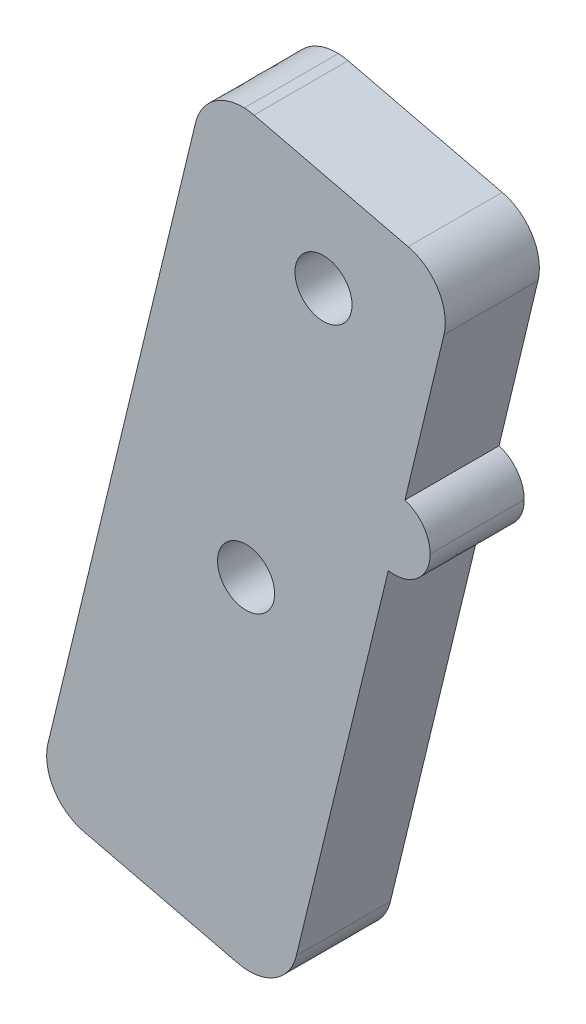
ISO-10303-21;
HEADER;
FILE_DESCRIPTION(('STEP AP214'),'2;1');
FILE_NAME('part.step','',(''),(''),'','','');
FILE_SCHEMA(('AUTOMOTIVE_DESIGN { 1 0 10303 214 1 1 1 1 }'));
ENDSEC;
DATA;
#1=APPLICATION_CONTEXT('core data for automotive mechanical design processes');
#2=APPLICATION_PROTOCOL_DEFINITION('international standard','automotive_design',2000,#1);
#3=PRODUCT_CONTEXT('',#1,'mechanical');
#4=PRODUCT('Part','Part','',(#3));
#5=PRODUCT_RELATED_PRODUCT_CATEGORY('part','',(#4));
#6=PRODUCT_DEFINITION_FORMATION('','',#4);
#7=PRODUCT_DEFINITION_CONTEXT('part definition',#1,'design');
#8=PRODUCT_DEFINITION('design','',#6,#7);
#9=PRODUCT_DEFINITION_SHAPE('','',#8);
#10=(LENGTH_UNIT() NAMED_UNIT(*) SI_UNIT(.MILLI.,.METRE.));
#11=(NAMED_UNIT(*) PLANE_ANGLE_UNIT() SI_UNIT($,.RADIAN.));
#12=(NAMED_UNIT(*) SI_UNIT($,.STERADIAN.) SOLID_ANGLE_UNIT());
#13=UNCERTAINTY_MEASURE_WITH_UNIT(LENGTH_MEASURE(1.E-05),#10,'distance_accuracy_value','');
#14=(GEOMETRIC_REPRESENTATION_CONTEXT(3) GLOBAL_UNCERTAINTY_ASSIGNED_CONTEXT((#13)) GLOBAL_UNIT_ASSIGNED_CONTEXT((#10,
#11,#12)) REPRESENTATION_CONTEXT('',''));
#15=CARTESIAN_POINT('',(0.,0.,0.));
#16=DIRECTION('',(0.,0.,1.));
#17=DIRECTION('',(1.,0.,0.));
#18=AXIS2_PLACEMENT_3D('',#15,#16,#17);
#19=CARTESIAN_POINT('',(-259.2686875,80.2486875,6.35));
#20=DIRECTION('',(0.,0.,-1.));
#21=DIRECTION('',(-1.,0.,0.));
#22=AXIS2_PLACEMENT_3D('',#19,#20,#21);
#23=PLANE('',#22);
#24=CARTESIAN_POINT('',(-258.9389,80.1862,6.35));
#25=CARTESIAN_POINT('',(-259.1594,80.2398,6.35));
#26=CARTESIAN_POINT('',(-259.3787,80.2689,6.35));
#27=CARTESIAN_POINT('',(-259.5963,80.2772,6.35));
#28=B_SPLINE_CURVE_WITH_KNOTS('',3,(#24,#25,#26,#27),.UNSPECIFIED.,.F.,.F.,(4,4),
(0.857142857142857,1.),.UNSPECIFIED.);
#29=CARTESIAN_POINT('',(-258.9389,80.1862,6.35));
#30=VERTEX_POINT('',#29);
#31=CARTESIAN_POINT('',(-259.5963,80.2772,6.35));
#32=VERTEX_POINT('',#31);
#33=EDGE_CURVE('E252',#30,#32,#28,.T.);
#34=ORIENTED_EDGE('',*,*,#33,.T.);
#35=CARTESIAN_POINT('',(-259.5963,80.2772,6.35));
#36=CARTESIAN_POINT('',(-261.1217,80.3295,6.35));
#37=CARTESIAN_POINT('',(-262.5167,79.3095,6.35));
#38=CARTESIAN_POINT('',(-262.8855,77.7663,6.35));
#39=B_SPLINE_CURVE_WITH_KNOTS('',3,(#35,#36,#37,#38),.UNSPECIFIED.,.F.,.F.,(4,4),(0.,
0.0714285714285714),.UNSPECIFIED.);
#40=CARTESIAN_POINT('',(-262.8855,77.7663,6.35));
#41=VERTEX_POINT('',#40);
#42=EDGE_CURVE('E109',#32,#41,#39,.T.);
#43=ORIENTED_EDGE('',*,*,#42,.T.);
#44=DIRECTION('',(-0.234646214894141,-0.972080837089104,0.));
#45=VECTOR('',#44,1.);
#46=CARTESIAN_POINT('',(-262.8855,77.7663,6.35));
#47=LINE('',#46,#45);
#48=CARTESIAN_POINT('',(-272.8434,36.5132,6.35));
#49=VERTEX_POINT('',#48);
#50=EDGE_CURVE('E235',#41,#49,#47,.T.);
#51=ORIENTED_EDGE('',*,*,#50,.T.);
#52=CARTESIAN_POINT('',(-272.8434,36.5132,6.35));
#53=CARTESIAN_POINT('',(-273.2663,34.7494,6.35));
#54=CARTESIAN_POINT('',(-272.1875,32.9898,6.35));
#55=CARTESIAN_POINT('',(-270.4236,32.5666,6.35));
#56=B_SPLINE_CURVE_WITH_KNOTS('',3,(#52,#53,#54,#55),.UNSPECIFIED.,.F.,.F.,(4,4),
(0.142857142857143,0.214285714285714),.UNSPECIFIED.);
#57=CARTESIAN_POINT('',(-270.4236,32.5666,6.35));
#58=VERTEX_POINT('',#57);
#59=EDGE_CURVE('E230',#49,#58,#56,.T.);
#60=ORIENTED_EDGE('',*,*,#59,.T.);
#61=DIRECTION('',(0.972401988769845,-0.233311749032169,0.));
#62=VECTOR('',#61,1.);
#63=CARTESIAN_POINT('',(-270.4236,32.5666,6.35));
#64=LINE('',#63,#62);
#65=CARTESIAN_POINT('',(-260.0278,30.0723,6.35));
#66=VERTEX_POINT('',#65);
#67=EDGE_CURVE('E225',#58,#66,#64,.T.);
#68=ORIENTED_EDGE('',*,*,#67,.T.);
#69=CARTESIAN_POINT('',(-260.0278,30.0723,6.35));
#70=CARTESIAN_POINT('',(-258.2636,29.6496,6.35));
#71=CARTESIAN_POINT('',(-256.5027,30.7281,6.35));
#72=CARTESIAN_POINT('',(-256.0795,32.4923,6.35));
#73=B_SPLINE_CURVE_WITH_KNOTS('',3,(#69,#70,#71,#72),.UNSPECIFIED.,.F.,.F.,(4,4),
(0.285714285714286,0.357142857142857),.UNSPECIFIED.);
#74=CARTESIAN_POINT('',(-256.0795,32.4923,6.35));
#75=VERTEX_POINT('',#74);
#76=EDGE_CURVE('E220',#66,#75,#73,.T.);
#77=ORIENTED_EDGE('',*,*,#76,.T.);
#78=DIRECTION('',(0.235451077147894,0.971886202325095,0.));
#79=VECTOR('',#78,1.);
#80=CARTESIAN_POINT('',(-256.0795,32.4923,6.35));
#81=LINE('',#80,#79);
#82=CARTESIAN_POINT('',(-249.8766,58.0964,6.35));
#83=VERTEX_POINT('',#82);
#84=EDGE_CURVE('E201',#75,#83,#81,.T.);
#85=ORIENTED_EDGE('',*,*,#84,.T.);
#86=CARTESIAN_POINT('',(-249.8766,58.0964,6.35));
#87=CARTESIAN_POINT('',(-249.742,58.0727,6.35));
#88=CARTESIAN_POINT('',(-249.6054,58.0619,6.35));
#89=CARTESIAN_POINT('',(-249.4692,58.0619,6.35));
#90=B_SPLINE_CURVE_WITH_KNOTS('',3,(#86,#87,#88,#89),.UNSPECIFIED.,.F.,.F.,(4,4),
(0.428571428571428,0.5),.UNSPECIFIED.);
#91=CARTESIAN_POINT('',(-249.4692,58.0619,6.35));
#92=VERTEX_POINT('',#91);
#93=EDGE_CURVE('E193',#83,#92,#90,.T.);
#94=ORIENTED_EDGE('',*,*,#93,.T.);
#95=CARTESIAN_POINT('',(-249.4692,58.0619,6.35));
#96=CARTESIAN_POINT('',(-248.1365,58.0619,6.35));
#97=CARTESIAN_POINT('',(-247.0559,59.1417,6.35));
#98=CARTESIAN_POINT('',(-247.0559,60.4748,6.35));
#99=B_SPLINE_CURVE_WITH_KNOTS('',3,(#95,#96,#97,#98),.UNSPECIFIED.,.F.,.F.,(4,4),(0.5,
0.571428571428571),.UNSPECIFIED.);
#100=CARTESIAN_POINT('',(-247.0559,60.4748,6.35));
#101=VERTEX_POINT('',#100);
#102=EDGE_CURVE('E185',#92,#101,#99,.T.);
#103=ORIENTED_EDGE('',*,*,#102,.T.);
#104=CARTESIAN_POINT('',(-247.0559,60.4748,6.35));
#105=CARTESIAN_POINT('',(-247.0559,61.5318,6.35));
#106=CARTESIAN_POINT('',(-247.744,62.4645,6.35));
#107=CARTESIAN_POINT('',(-248.7524,62.7785,6.35));
#108=B_SPLINE_CURVE_WITH_KNOTS('',3,(#104,#105,#106,#107),.UNSPECIFIED.,.F.,.F.,(4,4),
(0.571428571428571,0.642857142857143),.UNSPECIFIED.);
#109=CARTESIAN_POINT('',(-248.7524,62.7785,6.35));
#110=VERTEX_POINT('',#109);
#111=EDGE_CURVE('E143',#101,#110,#108,.T.);
#112=ORIENTED_EDGE('',*,*,#111,.T.);
#113=DIRECTION('',(0.233143889222013,0.972442248628901,0.));
#114=VECTOR('',#113,1.);
#115=CARTESIAN_POINT('',(-248.7524,62.7785,6.35));
#116=LINE('',#115,#114);
#117=CARTESIAN_POINT('',(-246.1231,73.7453,6.35));
#118=VERTEX_POINT('',#117);
#119=EDGE_CURVE('E137',#110,#118,#116,.T.);
#120=ORIENTED_EDGE('',*,*,#119,.T.);
#121=CARTESIAN_POINT('',(-246.1231,73.7453,6.35));
#122=CARTESIAN_POINT('',(-245.7003,75.5091,6.35));
#123=CARTESIAN_POINT('',(-246.7789,77.27,6.35));
#124=CARTESIAN_POINT('',(-248.5431,77.6932,6.35));
#125=B_SPLINE_CURVE_WITH_KNOTS('',3,(#121,#122,#123,#124),.UNSPECIFIED.,.F.,.F.,(4,4),
(0.714285714285714,0.785714285714286),.UNSPECIFIED.);
#126=CARTESIAN_POINT('',(-248.5431,77.6932,6.35));
#127=VERTEX_POINT('',#126);
#128=EDGE_CURVE('E141',#118,#127,#125,.T.);
#129=ORIENTED_EDGE('',*,*,#128,.T.);
#130=DIRECTION('',(-0.972429570341583,0.233196763968295,0.));
#131=VECTOR('',#130,1.);
#132=CARTESIAN_POINT('',(-248.5431,77.6932,6.35));
#133=LINE('',#132,#131);
#134=EDGE_CURVE('E51',#127,#30,#133,.T.);
#135=ORIENTED_EDGE('',*,*,#134,.T.);
#136=EDGE_LOOP('',(#34,#43,#51,#60,#68,#77,#85,#94,#103,#112,#120,#129,#135));
#137=FACE_BOUND('',#136,.T.);
#138=CARTESIAN_POINT('',(-254.25285,72.3954,6.35));
#139=DIRECTION('',(0.,0.,1.));
#140=DIRECTION('',(1.,0.,0.));
#141=AXIS2_PLACEMENT_3D('',#138,#139,#140);
#142=CIRCLE('',#141,1.92506978380005);
#143=CARTESIAN_POINT('',(-252.3277802162,72.3954,6.35));
#144=VERTEX_POINT('',#143);
#145=EDGE_CURVE('E266',#144,#144,#142,.T.);
#146=ORIENTED_EDGE('',*,*,#145,.F.);
#147=EDGE_LOOP('',(#146));
#148=FACE_BOUND('',#147,.T.);
#149=CARTESIAN_POINT('',(-259.47565,52.9045,6.35));
#150=DIRECTION('',(0.,0.,1.));
#151=DIRECTION('',(1.,0.,0.));
#152=AXIS2_PLACEMENT_3D('',#149,#150,#151);
#153=CIRCLE('',#152,1.92506978380005);
#154=CARTESIAN_POINT('',(-257.5505802162,52.9045,6.35));
#155=VERTEX_POINT('',#154);
#156=EDGE_CURVE('E267',#155,#155,#153,.T.);
#157=ORIENTED_EDGE('',*,*,#156,.F.);
#158=EDGE_LOOP('',(#157));
#159=FACE_BOUND('',#158,.T.);
#160=ADVANCED_FACE('F33',(#137,#148,#159),#23,.F.);
#161=CARTESIAN_POINT('',(-259.2686875,80.2486875,0.));
#162=DIRECTION('',(0.,0.,-1.));
#163=DIRECTION('',(-1.,0.,0.));
#164=AXIS2_PLACEMENT_3D('',#161,#162,#163);
#165=PLANE('',#164);
#166=CARTESIAN_POINT('',(-254.25285,72.3954,0.));
#167=DIRECTION('',(0.,0.,1.));
#168=DIRECTION('',(1.,0.,0.));
#169=AXIS2_PLACEMENT_3D('',#166,#167,#168);
#170=CIRCLE('',#169,1.92506978380005);
#171=CARTESIAN_POINT('',(-252.3277802162,72.3954,0.));
#172=VERTEX_POINT('',#171);
#173=EDGE_CURVE('E260',#172,#172,#170,.T.);
#174=ORIENTED_EDGE('',*,*,#173,.T.);
#175=EDGE_LOOP('',(#174));
#176=FACE_BOUND('',#175,.T.);
#177=CARTESIAN_POINT('',(-258.9389,80.1862,0.));
#178=CARTESIAN_POINT('',(-259.1594,80.2398,0.));
#179=CARTESIAN_POINT('',(-259.3787,80.2689,0.));
#180=CARTESIAN_POINT('',(-259.5963,80.2772,0.));
#181=B_SPLINE_CURVE_WITH_KNOTS('',3,(#177,#178,#179,#180),.UNSPECIFIED.,.F.,.F.,(4,4),
(0.857142857142857,1.),.UNSPECIFIED.);
#182=CARTESIAN_POINT('',(-258.9389,80.1862,0.));
#183=VERTEX_POINT('',#182);
#184=CARTESIAN_POINT('',(-259.5963,80.2772,0.));
#185=VERTEX_POINT('',#184);
#186=EDGE_CURVE('E270',#183,#185,#181,.T.);
#187=ORIENTED_EDGE('',*,*,#186,.F.);
#188=DIRECTION('',(-0.972429570341583,0.233196763968295,0.));
#189=VECTOR('',#188,1.);
#190=CARTESIAN_POINT('',(-248.5431,77.6932,0.));
#191=LINE('',#190,#189);
#192=CARTESIAN_POINT('',(-248.5431,77.6932,0.));
#193=VERTEX_POINT('',#192);
#194=EDGE_CURVE('E101',#193,#183,#191,.T.);
#195=ORIENTED_EDGE('',*,*,#194,.F.);
#196=CARTESIAN_POINT('',(-246.1231,73.7453,0.));
#197=CARTESIAN_POINT('',(-245.7003,75.5091,0.));
#198=CARTESIAN_POINT('',(-246.7789,77.27,0.));
#199=CARTESIAN_POINT('',(-248.5431,77.6932,0.));
#200=B_SPLINE_CURVE_WITH_KNOTS('',3,(#196,#197,#198,#199),.UNSPECIFIED.,.F.,.F.,(4,4),
(0.714285714285714,0.785714285714286),.UNSPECIFIED.);
#201=CARTESIAN_POINT('',(-246.1231,73.7453,0.));
#202=VERTEX_POINT('',#201);
#203=EDGE_CURVE('E95',#202,#193,#200,.T.);
#204=ORIENTED_EDGE('',*,*,#203,.F.);
#205=DIRECTION('',(0.233143889222013,0.972442248628901,0.));
#206=VECTOR('',#205,1.);
#207=CARTESIAN_POINT('',(-248.7524,62.7785,0.));
#208=LINE('',#207,#206);
#209=CARTESIAN_POINT('',(-248.7524,62.7785,0.));
#210=VERTEX_POINT('',#209);
#211=EDGE_CURVE('E151',#210,#202,#208,.T.);
#212=ORIENTED_EDGE('',*,*,#211,.F.);
#213=CARTESIAN_POINT('',(-247.0559,60.4748,0.));
#214=CARTESIAN_POINT('',(-247.0559,61.5318,0.));
#215=CARTESIAN_POINT('',(-247.744,62.4645,0.));
#216=CARTESIAN_POINT('',(-248.7524,62.7785,0.));
#217=B_SPLINE_CURVE_WITH_KNOTS('',3,(#213,#214,#215,#216),.UNSPECIFIED.,.F.,.F.,(4,4),
(0.571428571428571,0.642857142857143),.UNSPECIFIED.);
#218=CARTESIAN_POINT('',(-247.0559,60.4748,0.));
#219=VERTEX_POINT('',#218);
#220=EDGE_CURVE('E449',#219,#210,#217,.T.);
#221=ORIENTED_EDGE('',*,*,#220,.F.);
#222=CARTESIAN_POINT('',(-249.4692,58.0619,0.));
#223=CARTESIAN_POINT('',(-248.1365,58.0619,0.));
#224=CARTESIAN_POINT('',(-247.0559,59.1417,0.));
#225=CARTESIAN_POINT('',(-247.0559,60.4748,0.));
#226=B_SPLINE_CURVE_WITH_KNOTS('',3,(#222,#223,#224,#225),.UNSPECIFIED.,.F.,.F.,(4,4),(0.5,
0.571428571428571),.UNSPECIFIED.);
#227=CARTESIAN_POINT('',(-249.4692,58.0619,0.));
#228=VERTEX_POINT('',#227);
#229=EDGE_CURVE('E442',#228,#219,#226,.T.);
#230=ORIENTED_EDGE('',*,*,#229,.F.);
#231=CARTESIAN_POINT('',(-249.8766,58.0964,0.));
#232=CARTESIAN_POINT('',(-249.742,58.0727,0.));
#233=CARTESIAN_POINT('',(-249.6054,58.0619,0.));
#234=CARTESIAN_POINT('',(-249.4692,58.0619,0.));
#235=B_SPLINE_CURVE_WITH_KNOTS('',3,(#231,#232,#233,#234),.UNSPECIFIED.,.F.,.F.,(4,4),
(0.428571428571428,0.5),.UNSPECIFIED.);
#236=CARTESIAN_POINT('',(-249.8766,58.0964,0.));
#237=VERTEX_POINT('',#236);
#238=EDGE_CURVE('E438',#237,#228,#235,.T.);
#239=ORIENTED_EDGE('',*,*,#238,.F.);
#240=DIRECTION('',(0.235451077147894,0.971886202325095,0.));
#241=VECTOR('',#240,1.);
#242=CARTESIAN_POINT('',(-256.0795,32.4923,0.));
#243=LINE('',#242,#241);
#244=CARTESIAN_POINT('',(-256.0795,32.4923,0.));
#245=VERTEX_POINT('',#244);
#246=EDGE_CURVE('E433',#245,#237,#243,.T.);
#247=ORIENTED_EDGE('',*,*,#246,.F.);
#248=CARTESIAN_POINT('',(-260.0278,30.0723,0.));
#249=CARTESIAN_POINT('',(-258.2636,29.6496,0.));
#250=CARTESIAN_POINT('',(-256.5027,30.7281,0.));
#251=CARTESIAN_POINT('',(-256.0795,32.4923,0.));
#252=B_SPLINE_CURVE_WITH_KNOTS('',3,(#248,#249,#250,#251),.UNSPECIFIED.,.F.,.F.,(4,4),
(0.285714285714286,0.357142857142857),.UNSPECIFIED.);
#253=CARTESIAN_POINT('',(-260.0278,30.0723,0.));
#254=VERTEX_POINT('',#253);
#255=EDGE_CURVE('E429',#254,#245,#252,.T.);
#256=ORIENTED_EDGE('',*,*,#255,.F.);
#257=DIRECTION('',(0.972401988769845,-0.233311749032169,0.));
#258=VECTOR('',#257,1.);
#259=CARTESIAN_POINT('',(-270.4236,32.5666,0.));
#260=LINE('',#259,#258);
#261=CARTESIAN_POINT('',(-270.4236,32.5666,0.));
#262=VERTEX_POINT('',#261);
#263=EDGE_CURVE('E424',#262,#254,#260,.T.);
#264=ORIENTED_EDGE('',*,*,#263,.F.);
#265=CARTESIAN_POINT('',(-272.8434,36.5132,0.));
#266=CARTESIAN_POINT('',(-273.2663,34.7494,0.));
#267=CARTESIAN_POINT('',(-272.1875,32.9898,0.));
#268=CARTESIAN_POINT('',(-270.4236,32.5666,0.));
#269=B_SPLINE_CURVE_WITH_KNOTS('',3,(#265,#266,#267,#268),.UNSPECIFIED.,.F.,.F.,(4,4),
(0.142857142857143,0.214285714285714),.UNSPECIFIED.);
#270=CARTESIAN_POINT('',(-272.8434,36.5132,0.));
#271=VERTEX_POINT('',#270);
#272=EDGE_CURVE('E420',#271,#262,#269,.T.);
#273=ORIENTED_EDGE('',*,*,#272,.F.);
#274=DIRECTION('',(-0.234646214894141,-0.972080837089104,0.));
#275=VECTOR('',#274,1.);
#276=CARTESIAN_POINT('',(-262.8855,77.7663,0.));
#277=LINE('',#276,#275);
#278=CARTESIAN_POINT('',(-262.8855,77.7663,0.));
#279=VERTEX_POINT('',#278);
#280=EDGE_CURVE('E406',#279,#271,#277,.T.);
#281=ORIENTED_EDGE('',*,*,#280,.F.);
#282=CARTESIAN_POINT('',(-259.5963,80.2772,0.));
#283=CARTESIAN_POINT('',(-261.1217,80.3295,0.));
#284=CARTESIAN_POINT('',(-262.5167,79.3095,0.));
#285=CARTESIAN_POINT('',(-262.8855,77.7663,0.));
#286=B_SPLINE_CURVE_WITH_KNOTS('',3,(#282,#283,#284,#285),.UNSPECIFIED.,.F.,.F.,(4,4),(0.,
0.0714285714285714),.UNSPECIFIED.);
#287=EDGE_CURVE('E405',#185,#279,#286,.T.);
#288=ORIENTED_EDGE('',*,*,#287,.F.);
#289=EDGE_LOOP('',(#187,#195,#204,#212,#221,#230,#239,#247,#256,#264,#273,#281,#288));
#290=FACE_BOUND('',#289,.T.);
#291=CARTESIAN_POINT('',(-259.47565,52.9045,0.));
#292=DIRECTION('',(0.,0.,1.));
#293=DIRECTION('',(1.,0.,0.));
#294=AXIS2_PLACEMENT_3D('',#291,#292,#293);
#295=CIRCLE('',#294,1.92506978380005);
#296=CARTESIAN_POINT('',(-257.5505802162,52.9045,0.));
#297=VERTEX_POINT('',#296);
#298=EDGE_CURVE('E271',#297,#297,#295,.T.);
#299=ORIENTED_EDGE('',*,*,#298,.T.);
#300=EDGE_LOOP('',(#299));
#301=FACE_BOUND('',#300,.T.);
#302=ADVANCED_FACE('F281',(#176,#290,#301),#165,.T.);
#303=DIRECTION('',(0.,0.,-1.));
#304=VECTOR('',#303,1.);
#305=SURFACE_OF_LINEAR_EXTRUSION('',#28,#304);
#306=ORIENTED_EDGE('',*,*,#186,.T.);
#307=DIRECTION('',(0.,0.,-1.));
#308=VECTOR('',#307,1.);
#309=CARTESIAN_POINT('',(-259.5963,80.2772,6.35));
#310=LINE('',#309,#308);
#311=EDGE_CURVE('E11',#32,#185,#310,.T.);
#312=ORIENTED_EDGE('',*,*,#311,.F.);
#313=ORIENTED_EDGE('',*,*,#33,.F.);
#314=DIRECTION('',(0.,0.,-1.));
#315=VECTOR('',#314,1.);
#316=CARTESIAN_POINT('',(-258.9389,80.1862,6.35));
#317=LINE('',#316,#315);
#318=EDGE_CURVE('E157',#30,#183,#317,.T.);
#319=ORIENTED_EDGE('',*,*,#318,.T.);
#320=EDGE_LOOP('',(#306,#312,#313,#319));
#321=FACE_BOUND('',#320,.T.);
#322=ADVANCED_FACE('F35',(#321),#305,.F.);
#323=DIRECTION('',(0.,0.,-1.));
#324=VECTOR('',#323,1.);
#325=SURFACE_OF_LINEAR_EXTRUSION('',#39,#324);
#326=ORIENTED_EDGE('',*,*,#287,.T.);
#327=DIRECTION('',(0.,0.,-1.));
#328=VECTOR('',#327,1.);
#329=CARTESIAN_POINT('',(-262.8855,77.7663,6.35));
#330=LINE('',#329,#328);
#331=EDGE_CURVE('E43',#41,#279,#330,.T.);
#332=ORIENTED_EDGE('',*,*,#331,.F.);
#333=ORIENTED_EDGE('',*,*,#42,.F.);
#334=ORIENTED_EDGE('',*,*,#311,.T.);
#335=EDGE_LOOP('',(#326,#332,#333,#334));
#336=FACE_BOUND('',#335,.T.);
#337=ADVANCED_FACE('F246',(#336),#325,.F.);
#338=CARTESIAN_POINT('',(-262.8855,77.7663,6.35));
#339=DIRECTION('',(0.972080837089104,-0.234646214894141,0.));
#340=DIRECTION('',(0.234646214894141,0.972080837089104,0.));
#341=AXIS2_PLACEMENT_3D('',#338,#339,#340);
#342=PLANE('',#341);
#343=ORIENTED_EDGE('',*,*,#280,.T.);
#344=DIRECTION('',(0.,0.,-1.));
#345=VECTOR('',#344,1.);
#346=CARTESIAN_POINT('',(-272.8434,36.5132,6.35));
#347=LINE('',#346,#345);
#348=EDGE_CURVE('E488',#49,#271,#347,.T.);
#349=ORIENTED_EDGE('',*,*,#348,.F.);
#350=ORIENTED_EDGE('',*,*,#50,.F.);
#351=ORIENTED_EDGE('',*,*,#331,.T.);
#352=EDGE_LOOP('',(#343,#349,#350,#351));
#353=FACE_BOUND('',#352,.T.);
#354=ADVANCED_FACE('F243',(#353),#342,.F.);
#355=DIRECTION('',(0.,0.,-1.));
#356=VECTOR('',#355,1.);
#357=SURFACE_OF_LINEAR_EXTRUSION('',#56,#356);
#358=ORIENTED_EDGE('',*,*,#272,.T.);
#359=DIRECTION('',(0.,0.,-1.));
#360=VECTOR('',#359,1.);
#361=CARTESIAN_POINT('',(-270.4236,32.5666,6.35));
#362=LINE('',#361,#360);
#363=EDGE_CURVE('E485',#58,#262,#362,.T.);
#364=ORIENTED_EDGE('',*,*,#363,.F.);
#365=ORIENTED_EDGE('',*,*,#59,.F.);
#366=ORIENTED_EDGE('',*,*,#348,.T.);
#367=EDGE_LOOP('',(#358,#364,#365,#366));
#368=FACE_BOUND('',#367,.T.);
#369=ADVANCED_FACE('F240',(#368),#357,.F.);
#370=CARTESIAN_POINT('',(-270.4236,32.5666,6.35));
#371=DIRECTION('',(0.233311749032169,0.972401988769845,0.));
#372=DIRECTION('',(-0.972401988769845,0.23331174903217,0.));
#373=AXIS2_PLACEMENT_3D('',#370,#371,#372);
#374=PLANE('',#373);
#375=ORIENTED_EDGE('',*,*,#263,.T.);
#376=DIRECTION('',(0.,0.,-1.));
#377=VECTOR('',#376,1.);
#378=CARTESIAN_POINT('',(-260.0278,30.0723,6.35));
#379=LINE('',#378,#377);
#380=EDGE_CURVE('E482',#66,#254,#379,.T.);
#381=ORIENTED_EDGE('',*,*,#380,.F.);
#382=ORIENTED_EDGE('',*,*,#67,.F.);
#383=ORIENTED_EDGE('',*,*,#363,.T.);
#384=EDGE_LOOP('',(#375,#381,#382,#383));
#385=FACE_BOUND('',#384,.T.);
#386=ADVANCED_FACE('F217',(#385),#374,.F.);
#387=DIRECTION('',(0.,0.,-1.));
#388=VECTOR('',#387,1.);
#389=SURFACE_OF_LINEAR_EXTRUSION('',#73,#388);
#390=ORIENTED_EDGE('',*,*,#255,.T.);
#391=DIRECTION('',(0.,0.,-1.));
#392=VECTOR('',#391,1.);
#393=CARTESIAN_POINT('',(-256.0795,32.4923,6.35));
#394=LINE('',#393,#392);
#395=EDGE_CURVE('E479',#75,#245,#394,.T.);
#396=ORIENTED_EDGE('',*,*,#395,.F.);
#397=ORIENTED_EDGE('',*,*,#76,.F.);
#398=ORIENTED_EDGE('',*,*,#380,.T.);
#399=EDGE_LOOP('',(#390,#396,#397,#398));
#400=FACE_BOUND('',#399,.T.);
#401=ADVANCED_FACE('F213',(#400),#389,.F.);
#402=CARTESIAN_POINT('',(-256.0795,32.4923,6.35));
#403=DIRECTION('',(-0.971886202325095,0.235451077147894,0.));
#404=DIRECTION('',(-0.235451077147894,-0.971886202325096,0.));
#405=AXIS2_PLACEMENT_3D('',#402,#403,#404);
#406=PLANE('',#405);
#407=ORIENTED_EDGE('',*,*,#246,.T.);
#408=DIRECTION('',(0.,0.,-1.));
#409=VECTOR('',#408,1.);
#410=CARTESIAN_POINT('',(-249.8766,58.0964,6.35));
#411=LINE('',#410,#409);
#412=EDGE_CURVE('E476',#83,#237,#411,.T.);
#413=ORIENTED_EDGE('',*,*,#412,.F.);
#414=ORIENTED_EDGE('',*,*,#84,.F.);
#415=ORIENTED_EDGE('',*,*,#395,.T.);
#416=EDGE_LOOP('',(#407,#413,#414,#415));
#417=FACE_BOUND('',#416,.T.);
#418=ADVANCED_FACE('F209',(#417),#406,.F.);
#419=DIRECTION('',(0.,0.,-1.));
#420=VECTOR('',#419,1.);
#421=SURFACE_OF_LINEAR_EXTRUSION('',#90,#420);
#422=ORIENTED_EDGE('',*,*,#238,.T.);
#423=DIRECTION('',(0.,0.,-1.));
#424=VECTOR('',#423,1.);
#425=CARTESIAN_POINT('',(-249.4692,58.0619,6.35));
#426=LINE('',#425,#424);
#427=EDGE_CURVE('E473',#92,#228,#426,.T.);
#428=ORIENTED_EDGE('',*,*,#427,.F.);
#429=ORIENTED_EDGE('',*,*,#93,.F.);
#430=ORIENTED_EDGE('',*,*,#412,.T.);
#431=EDGE_LOOP('',(#422,#428,#429,#430));
#432=FACE_BOUND('',#431,.T.);
#433=ADVANCED_FACE('F206',(#432),#421,.F.);
#434=DIRECTION('',(0.,0.,-1.));
#435=VECTOR('',#434,1.);
#436=SURFACE_OF_LINEAR_EXTRUSION('',#99,#435);
#437=ORIENTED_EDGE('',*,*,#229,.T.);
#438=DIRECTION('',(0.,0.,-1.));
#439=VECTOR('',#438,1.);
#440=CARTESIAN_POINT('',(-247.0559,60.4748,6.35));
#441=LINE('',#440,#439);
#442=EDGE_CURVE('E470',#101,#219,#441,.T.);
#443=ORIENTED_EDGE('',*,*,#442,.F.);
#444=ORIENTED_EDGE('',*,*,#102,.F.);
#445=ORIENTED_EDGE('',*,*,#427,.T.);
#446=EDGE_LOOP('',(#437,#443,#444,#445));
#447=FACE_BOUND('',#446,.T.);
#448=ADVANCED_FACE('F178',(#447),#436,.F.);
#449=DIRECTION('',(0.,0.,-1.));
#450=VECTOR('',#449,1.);
#451=SURFACE_OF_LINEAR_EXTRUSION('',#108,#450);
#452=ORIENTED_EDGE('',*,*,#220,.T.);
#453=DIRECTION('',(0.,0.,-1.));
#454=VECTOR('',#453,1.);
#455=CARTESIAN_POINT('',(-248.7524,62.7785,6.35));
#456=LINE('',#455,#454);
#457=EDGE_CURVE('E152',#110,#210,#456,.T.);
#458=ORIENTED_EDGE('',*,*,#457,.F.);
#459=ORIENTED_EDGE('',*,*,#111,.F.);
#460=ORIENTED_EDGE('',*,*,#442,.T.);
#461=EDGE_LOOP('',(#452,#458,#459,#460));
#462=FACE_BOUND('',#461,.T.);
#463=ADVANCED_FACE('F175',(#462),#451,.F.);
#464=CARTESIAN_POINT('',(-248.7524,62.7785,6.35));
#465=DIRECTION('',(-0.972442248628901,0.233143889222013,0.));
#466=DIRECTION('',(-0.233143889222013,-0.972442248628901,0.));
#467=AXIS2_PLACEMENT_3D('',#464,#465,#466);
#468=PLANE('',#467);
#469=ORIENTED_EDGE('',*,*,#211,.T.);
#470=DIRECTION('',(0.,0.,-1.));
#471=VECTOR('',#470,1.);
#472=CARTESIAN_POINT('',(-246.1231,73.7453,6.35));
#473=LINE('',#472,#471);
#474=EDGE_CURVE('E148',#118,#202,#473,.T.);
#475=ORIENTED_EDGE('',*,*,#474,.F.);
#476=ORIENTED_EDGE('',*,*,#119,.F.);
#477=ORIENTED_EDGE('',*,*,#457,.T.);
#478=EDGE_LOOP('',(#469,#475,#476,#477));
#479=FACE_BOUND('',#478,.T.);
#480=ADVANCED_FACE('F149',(#479),#468,.F.);
#481=DIRECTION('',(0.,0.,-1.));
#482=VECTOR('',#481,1.);
#483=SURFACE_OF_LINEAR_EXTRUSION('',#125,#482);
#484=ORIENTED_EDGE('',*,*,#203,.T.);
#485=DIRECTION('',(0.,0.,-1.));
#486=VECTOR('',#485,1.);
#487=CARTESIAN_POINT('',(-248.5431,77.6932,6.35));
#488=LINE('',#487,#486);
#489=EDGE_CURVE('E153',#127,#193,#488,.T.);
#490=ORIENTED_EDGE('',*,*,#489,.F.);
#491=ORIENTED_EDGE('',*,*,#128,.F.);
#492=ORIENTED_EDGE('',*,*,#474,.T.);
#493=EDGE_LOOP('',(#484,#490,#491,#492));
#494=FACE_BOUND('',#493,.T.);
#495=ADVANCED_FACE('F155',(#494),#483,.F.);
#496=CARTESIAN_POINT('',(-248.5431,77.6932,6.35));
#497=DIRECTION('',(-0.233196763968295,-0.972429570341583,0.));
#498=DIRECTION('',(0.972429570341583,-0.233196763968295,0.));
#499=AXIS2_PLACEMENT_3D('',#496,#497,#498);
#500=PLANE('',#499);
#501=ORIENTED_EDGE('',*,*,#194,.T.);
#502=ORIENTED_EDGE('',*,*,#318,.F.);
#503=ORIENTED_EDGE('',*,*,#134,.F.);
#504=ORIENTED_EDGE('',*,*,#489,.T.);
#505=EDGE_LOOP('',(#501,#502,#503,#504));
#506=FACE_BOUND('',#505,.T.);
#507=ADVANCED_FACE('F171',(#506),#500,.F.);
#508=CARTESIAN_POINT('',(-254.25285,72.3954,6.35));
#509=DIRECTION('',(0.,0.,-1.));
#510=DIRECTION('',(-1.,0.,0.));
#511=AXIS2_PLACEMENT_3D('',#508,#509,#510);
#512=CYLINDRICAL_SURFACE('',#511,1.92506978380005);
#513=ORIENTED_EDGE('',*,*,#145,.T.);
#514=EDGE_LOOP('',(#513));
#515=FACE_BOUND('',#514,.T.);
#516=ORIENTED_EDGE('',*,*,#173,.F.);
#517=EDGE_LOOP('',(#516));
#518=FACE_BOUND('',#517,.T.);
#519=ADVANCED_FACE('F288',(#515,#518),#512,.F.);
#520=CARTESIAN_POINT('',(-259.47565,52.9045,6.35));
#521=DIRECTION('',(0.,0.,-1.));
#522=DIRECTION('',(-1.,0.,0.));
#523=AXIS2_PLACEMENT_3D('',#520,#521,#522);
#524=CYLINDRICAL_SURFACE('',#523,1.92506978380005);
#525=ORIENTED_EDGE('',*,*,#156,.T.);
#526=EDGE_LOOP('',(#525));
#527=FACE_BOUND('',#526,.T.);
#528=ORIENTED_EDGE('',*,*,#298,.F.);
#529=EDGE_LOOP('',(#528));
#530=FACE_BOUND('',#529,.T.);
#531=ADVANCED_FACE('F277',(#527,#530),#524,.F.);
#532=CLOSED_SHELL('',(#160,#302,#322,#337,#354,#369,#386,#401,#418,#433,#448,#463,#480,#495,
#507,#519,#531));
#533=MANIFOLD_SOLID_BREP('B2',#532);
#534=ADVANCED_BREP_SHAPE_REPRESENTATION('',(#18,#533),#14);
#535=SHAPE_DEFINITION_REPRESENTATION(#9,#534);
ENDSEC;
END-ISO-10303-21;
